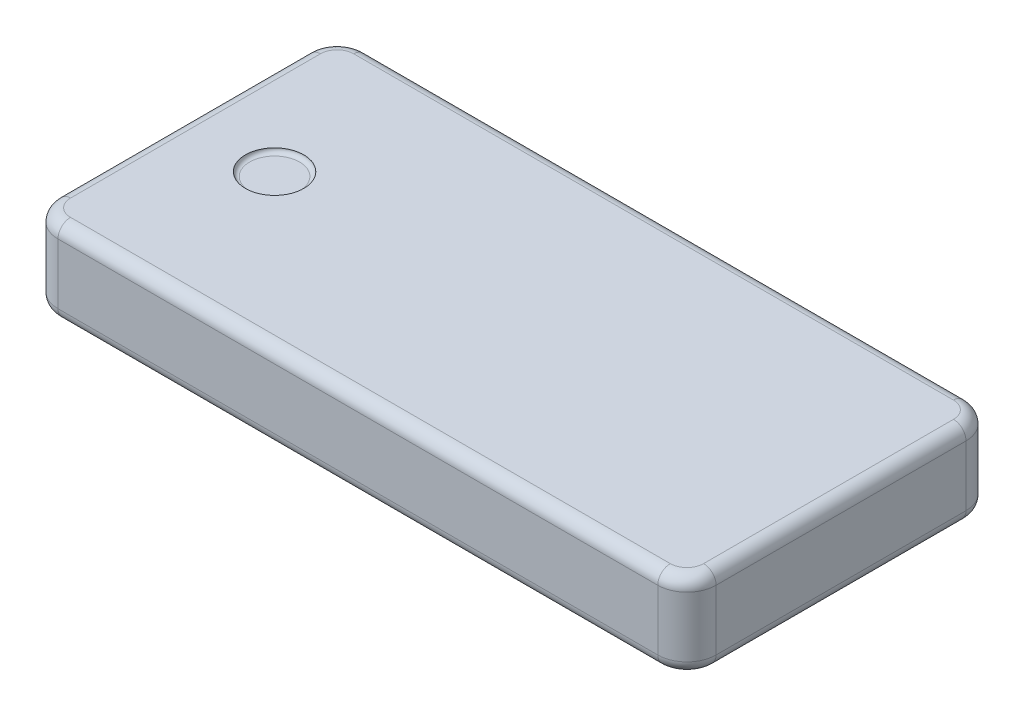
ISO-10303-21;
HEADER;
FILE_DESCRIPTION(('STEP AP214'),'2;1');
FILE_NAME('part.step','',(''),(''),'','','');
FILE_SCHEMA(('AUTOMOTIVE_DESIGN { 1 0 10303 214 1 1 1 1 }'));
ENDSEC;
DATA;
#1=APPLICATION_CONTEXT('core data for automotive mechanical design processes');
#2=APPLICATION_PROTOCOL_DEFINITION('international standard','automotive_design',2000,#1);
#3=PRODUCT_CONTEXT('',#1,'mechanical');
#4=PRODUCT('Part','Part','',(#3));
#5=PRODUCT_RELATED_PRODUCT_CATEGORY('part','',(#4));
#6=PRODUCT_DEFINITION_FORMATION('','',#4);
#7=PRODUCT_DEFINITION_CONTEXT('part definition',#1,'design');
#8=PRODUCT_DEFINITION('design','',#6,#7);
#9=PRODUCT_DEFINITION_SHAPE('','',#8);
#10=(LENGTH_UNIT() NAMED_UNIT(*) SI_UNIT(.MILLI.,.METRE.));
#11=(NAMED_UNIT(*) PLANE_ANGLE_UNIT() SI_UNIT($,.RADIAN.));
#12=(NAMED_UNIT(*) SI_UNIT($,.STERADIAN.) SOLID_ANGLE_UNIT());
#13=UNCERTAINTY_MEASURE_WITH_UNIT(LENGTH_MEASURE(1.E-05),#10,'distance_accuracy_value','');
#14=(GEOMETRIC_REPRESENTATION_CONTEXT(3) GLOBAL_UNCERTAINTY_ASSIGNED_CONTEXT((#13)) GLOBAL_UNIT_ASSIGNED_CONTEXT((#10,
#11,#12)) REPRESENTATION_CONTEXT('',''));
#15=CARTESIAN_POINT('',(0.,0.,0.));
#16=DIRECTION('',(0.,0.,1.));
#17=DIRECTION('',(1.,0.,0.));
#18=AXIS2_PLACEMENT_3D('',#15,#16,#17);
#19=CARTESIAN_POINT('',(151.,20.5,-67.));
#20=DIRECTION('',(0.,-1.,0.));
#21=DIRECTION('',(0.,0.,-1.));
#22=AXIS2_PLACEMENT_3D('',#19,#20,#21);
#23=CYLINDRICAL_SURFACE('',#22,7.00000000000001);
#24=DIRECTION('',(0.,-1.,0.));
#25=VECTOR('',#24,1.);
#26=CARTESIAN_POINT('',(158.,20.5,-67.));
#27=LINE('',#26,#25);
#28=CARTESIAN_POINT('',(158.,17.5,-67.));
#29=VERTEX_POINT('',#28);
#30=CARTESIAN_POINT('',(158.,3.,-67.));
#31=VERTEX_POINT('',#30);
#32=EDGE_CURVE('E265',#29,#31,#27,.T.);
#33=ORIENTED_EDGE('',*,*,#32,.T.);
#34=CARTESIAN_POINT('',(151.,3.,-67.));
#35=DIRECTION('',(0.,-1.,0.));
#36=DIRECTION('',(0.,0.,-1.));
#37=AXIS2_PLACEMENT_3D('',#34,#35,#36);
#38=CIRCLE('',#37,7.00000000000001);
#39=CARTESIAN_POINT('',(151.,3.,-74.));
#40=VERTEX_POINT('',#39);
#41=EDGE_CURVE('E344',#31,#40,#38,.F.);
#42=ORIENTED_EDGE('',*,*,#41,.T.);
#43=DIRECTION('',(0.,-1.,0.));
#44=VECTOR('',#43,1.);
#45=CARTESIAN_POINT('',(151.,20.5,-74.));
#46=LINE('',#45,#44);
#47=CARTESIAN_POINT('',(151.,17.5,-74.));
#48=VERTEX_POINT('',#47);
#49=EDGE_CURVE('E188',#48,#40,#46,.T.);
#50=ORIENTED_EDGE('',*,*,#49,.F.);
#51=CARTESIAN_POINT('',(151.,17.5,-67.));
#52=DIRECTION('',(0.,-1.,0.));
#53=DIRECTION('',(0.,0.,-1.));
#54=AXIS2_PLACEMENT_3D('',#51,#52,#53);
#55=CIRCLE('',#54,7.00000000000001);
#56=EDGE_CURVE('E341',#48,#29,#55,.T.);
#57=ORIENTED_EDGE('',*,*,#56,.T.);
#58=EDGE_LOOP('',(#33,#42,#50,#57));
#59=FACE_BOUND('',#58,.T.);
#60=ADVANCED_FACE('F39',(#59),#23,.T.);
#61=CARTESIAN_POINT('',(7.,20.5,-74.));
#62=DIRECTION('',(0.,0.,1.));
#63=DIRECTION('',(1.,0.,0.));
#64=AXIS2_PLACEMENT_3D('',#61,#62,#63);
#65=PLANE('',#64);
#66=ORIENTED_EDGE('',*,*,#49,.T.);
#67=DIRECTION('',(-1.,0.,0.));
#68=VECTOR('',#67,1.);
#69=CARTESIAN_POINT('',(7.,3.,-74.));
#70=LINE('',#69,#68);
#71=CARTESIAN_POINT('',(7.,3.,-74.));
#72=VERTEX_POINT('',#71);
#73=EDGE_CURVE('E338',#40,#72,#70,.T.);
#74=ORIENTED_EDGE('',*,*,#73,.T.);
#75=DIRECTION('',(0.,-1.,0.));
#76=VECTOR('',#75,1.);
#77=CARTESIAN_POINT('',(7.,20.5,-74.));
#78=LINE('',#77,#76);
#79=CARTESIAN_POINT('',(7.,17.5,-74.));
#80=VERTEX_POINT('',#79);
#81=EDGE_CURVE('E289',#80,#72,#78,.T.);
#82=ORIENTED_EDGE('',*,*,#81,.F.);
#83=DIRECTION('',(-1.,0.,0.));
#84=VECTOR('',#83,1.);
#85=CARTESIAN_POINT('',(7.,17.5,-74.));
#86=LINE('',#85,#84);
#87=EDGE_CURVE('E335',#80,#48,#86,.F.);
#88=ORIENTED_EDGE('',*,*,#87,.T.);
#89=EDGE_LOOP('',(#66,#74,#82,#88));
#90=FACE_BOUND('',#89,.T.);
#91=ADVANCED_FACE('F429',(#90),#65,.F.);
#92=CARTESIAN_POINT('',(7.,20.5,-67.));
#93=DIRECTION('',(0.,-1.,0.));
#94=DIRECTION('',(0.,0.,-1.));
#95=AXIS2_PLACEMENT_3D('',#92,#93,#94);
#96=CYLINDRICAL_SURFACE('',#95,7.);
#97=ORIENTED_EDGE('',*,*,#81,.T.);
#98=CARTESIAN_POINT('',(7.,3.,-67.));
#99=DIRECTION('',(0.,-1.,0.));
#100=DIRECTION('',(0.,0.,-1.));
#101=AXIS2_PLACEMENT_3D('',#98,#99,#100);
#102=CIRCLE('',#101,7.);
#103=CARTESIAN_POINT('',(0.,3.,-67.));
#104=VERTEX_POINT('',#103);
#105=EDGE_CURVE('E332',#72,#104,#102,.F.);
#106=ORIENTED_EDGE('',*,*,#105,.T.);
#107=DIRECTION('',(0.,-1.,0.));
#108=VECTOR('',#107,1.);
#109=CARTESIAN_POINT('',(0.,20.5,-67.));
#110=LINE('',#109,#108);
#111=CARTESIAN_POINT('',(0.,17.5,-67.));
#112=VERTEX_POINT('',#111);
#113=EDGE_CURVE('E285',#112,#104,#110,.T.);
#114=ORIENTED_EDGE('',*,*,#113,.F.);
#115=CARTESIAN_POINT('',(7.,17.5,-67.));
#116=DIRECTION('',(0.,-1.,0.));
#117=DIRECTION('',(0.,0.,-1.));
#118=AXIS2_PLACEMENT_3D('',#115,#116,#117);
#119=CIRCLE('',#118,7.);
#120=EDGE_CURVE('E329',#112,#80,#119,.T.);
#121=ORIENTED_EDGE('',*,*,#120,.T.);
#122=EDGE_LOOP('',(#97,#106,#114,#121));
#123=FACE_BOUND('',#122,.T.);
#124=ADVANCED_FACE('F405',(#123),#96,.T.);
#125=CARTESIAN_POINT('',(0.,20.5,-7.));
#126=DIRECTION('',(1.,0.,0.));
#127=DIRECTION('',(0.,0.,-1.));
#128=AXIS2_PLACEMENT_3D('',#125,#126,#127);
#129=PLANE('',#128);
#130=ORIENTED_EDGE('',*,*,#113,.T.);
#131=DIRECTION('',(0.,0.,1.));
#132=VECTOR('',#131,1.);
#133=CARTESIAN_POINT('',(0.,3.,-7.));
#134=LINE('',#133,#132);
#135=CARTESIAN_POINT('',(0.,3.,-7.));
#136=VERTEX_POINT('',#135);
#137=EDGE_CURVE('E326',#104,#136,#134,.T.);
#138=ORIENTED_EDGE('',*,*,#137,.T.);
#139=DIRECTION('',(0.,-1.,0.));
#140=VECTOR('',#139,1.);
#141=CARTESIAN_POINT('',(0.,20.5,-7.));
#142=LINE('',#141,#140);
#143=CARTESIAN_POINT('',(0.,17.5,-7.));
#144=VERTEX_POINT('',#143);
#145=EDGE_CURVE('E178',#144,#136,#142,.T.);
#146=ORIENTED_EDGE('',*,*,#145,.F.);
#147=DIRECTION('',(0.,0.,1.));
#148=VECTOR('',#147,1.);
#149=CARTESIAN_POINT('',(0.,17.5,-7.));
#150=LINE('',#149,#148);
#151=EDGE_CURVE('E323',#144,#112,#150,.F.);
#152=ORIENTED_EDGE('',*,*,#151,.T.);
#153=EDGE_LOOP('',(#130,#138,#146,#152));
#154=FACE_BOUND('',#153,.T.);
#155=ADVANCED_FACE('F402',(#154),#129,.F.);
#156=CARTESIAN_POINT('',(7.,20.5,-7.));
#157=DIRECTION('',(0.,-1.,0.));
#158=DIRECTION('',(0.,0.,-1.));
#159=AXIS2_PLACEMENT_3D('',#156,#157,#158);
#160=CYLINDRICAL_SURFACE('',#159,7.);
#161=ORIENTED_EDGE('',*,*,#145,.T.);
#162=CARTESIAN_POINT('',(7.,3.,-7.));
#163=DIRECTION('',(0.,-1.,0.));
#164=DIRECTION('',(0.,0.,-1.));
#165=AXIS2_PLACEMENT_3D('',#162,#163,#164);
#166=CIRCLE('',#165,7.);
#167=CARTESIAN_POINT('',(7.,3.,0.));
#168=VERTEX_POINT('',#167);
#169=EDGE_CURVE('E176',#136,#168,#166,.F.);
#170=ORIENTED_EDGE('',*,*,#169,.T.);
#171=DIRECTION('',(0.,-1.,0.));
#172=VECTOR('',#171,1.);
#173=CARTESIAN_POINT('',(7.,20.5,0.));
#174=LINE('',#173,#172);
#175=CARTESIAN_POINT('',(7.,17.5,0.));
#176=VERTEX_POINT('',#175);
#177=EDGE_CURVE('E157',#176,#168,#174,.T.);
#178=ORIENTED_EDGE('',*,*,#177,.F.);
#179=CARTESIAN_POINT('',(7.,17.5,-7.));
#180=DIRECTION('',(0.,-1.,0.));
#181=DIRECTION('',(0.,0.,-1.));
#182=AXIS2_PLACEMENT_3D('',#179,#180,#181);
#183=CIRCLE('',#182,7.);
#184=EDGE_CURVE('E173',#176,#144,#183,.T.);
#185=ORIENTED_EDGE('',*,*,#184,.T.);
#186=EDGE_LOOP('',(#161,#170,#178,#185));
#187=FACE_BOUND('',#186,.T.);
#188=ADVANCED_FACE('F172',(#187),#160,.T.);
#189=CARTESIAN_POINT('',(7.,20.5,0.));
#190=DIRECTION('',(0.,0.,-1.));
#191=DIRECTION('',(-1.,0.,0.));
#192=AXIS2_PLACEMENT_3D('',#189,#190,#191);
#193=PLANE('',#192);
#194=ORIENTED_EDGE('',*,*,#177,.T.);
#195=DIRECTION('',(1.,0.,0.));
#196=VECTOR('',#195,1.);
#197=CARTESIAN_POINT('',(151.,3.,0.));
#198=LINE('',#197,#196);
#199=CARTESIAN_POINT('',(151.,3.,0.));
#200=VERTEX_POINT('',#199);
#201=EDGE_CURVE('E48',#168,#200,#198,.T.);
#202=ORIENTED_EDGE('',*,*,#201,.T.);
#203=DIRECTION('',(0.,-1.,0.));
#204=VECTOR('',#203,1.);
#205=CARTESIAN_POINT('',(151.,20.5,0.));
#206=LINE('',#205,#204);
#207=CARTESIAN_POINT('',(151.,17.5,0.));
#208=VERTEX_POINT('',#207);
#209=EDGE_CURVE('E159',#208,#200,#206,.T.);
#210=ORIENTED_EDGE('',*,*,#209,.F.);
#211=DIRECTION('',(1.,0.,0.));
#212=VECTOR('',#211,1.);
#213=CARTESIAN_POINT('',(7.,17.5,0.));
#214=LINE('',#213,#212);
#215=EDGE_CURVE('E154',#208,#176,#214,.F.);
#216=ORIENTED_EDGE('',*,*,#215,.T.);
#217=EDGE_LOOP('',(#194,#202,#210,#216));
#218=FACE_BOUND('',#217,.T.);
#219=ADVANCED_FACE('F156',(#218),#193,.F.);
#220=CARTESIAN_POINT('',(151.,20.5,-7.));
#221=DIRECTION('',(0.,-1.,0.));
#222=DIRECTION('',(0.,0.,-1.));
#223=AXIS2_PLACEMENT_3D('',#220,#221,#222);
#224=CYLINDRICAL_SURFACE('',#223,7.);
#225=ORIENTED_EDGE('',*,*,#209,.T.);
#226=CARTESIAN_POINT('',(151.,3.,-7.));
#227=DIRECTION('',(0.,-1.,0.));
#228=DIRECTION('',(0.,0.,-1.));
#229=AXIS2_PLACEMENT_3D('',#226,#227,#228);
#230=CIRCLE('',#229,7.);
#231=CARTESIAN_POINT('',(158.,3.,-7.));
#232=VERTEX_POINT('',#231);
#233=EDGE_CURVE('E356',#200,#232,#230,.F.);
#234=ORIENTED_EDGE('',*,*,#233,.T.);
#235=DIRECTION('',(0.,-1.,0.));
#236=VECTOR('',#235,1.);
#237=CARTESIAN_POINT('',(158.,20.5,-7.));
#238=LINE('',#237,#236);
#239=CARTESIAN_POINT('',(158.,17.5,-7.));
#240=VERTEX_POINT('',#239);
#241=EDGE_CURVE('E272',#240,#232,#238,.T.);
#242=ORIENTED_EDGE('',*,*,#241,.F.);
#243=CARTESIAN_POINT('',(151.,17.5,-7.));
#244=DIRECTION('',(0.,-1.,0.));
#245=DIRECTION('',(0.,0.,-1.));
#246=AXIS2_PLACEMENT_3D('',#243,#244,#245);
#247=CIRCLE('',#246,7.);
#248=EDGE_CURVE('E353',#240,#208,#247,.T.);
#249=ORIENTED_EDGE('',*,*,#248,.T.);
#250=EDGE_LOOP('',(#225,#234,#242,#249));
#251=FACE_BOUND('',#250,.T.);
#252=ADVANCED_FACE('F444',(#251),#224,.T.);
#253=CARTESIAN_POINT('',(158.,20.5,-7.));
#254=DIRECTION('',(-1.,0.,0.));
#255=DIRECTION('',(0.,0.,1.));
#256=AXIS2_PLACEMENT_3D('',#253,#254,#255);
#257=PLANE('',#256);
#258=ORIENTED_EDGE('',*,*,#241,.T.);
#259=DIRECTION('',(0.,0.,-1.));
#260=VECTOR('',#259,1.);
#261=CARTESIAN_POINT('',(158.,3.,-67.));
#262=LINE('',#261,#260);
#263=EDGE_CURVE('E350',#232,#31,#262,.T.);
#264=ORIENTED_EDGE('',*,*,#263,.T.);
#265=ORIENTED_EDGE('',*,*,#32,.F.);
#266=DIRECTION('',(0.,0.,-1.));
#267=VECTOR('',#266,1.);
#268=CARTESIAN_POINT('',(158.,17.5,-7.));
#269=LINE('',#268,#267);
#270=EDGE_CURVE('E347',#29,#240,#269,.F.);
#271=ORIENTED_EDGE('',*,*,#270,.T.);
#272=EDGE_LOOP('',(#258,#264,#265,#271));
#273=FACE_BOUND('',#272,.T.);
#274=ADVANCED_FACE('F447',(#273),#257,.F.);
#275=CARTESIAN_POINT('',(151.,20.5,-67.));
#276=DIRECTION('',(0.,-1.,0.));
#277=DIRECTION('',(0.,0.,-1.));
#278=AXIS2_PLACEMENT_3D('',#275,#276,#277);
#279=PLANE('',#278);
#280=CARTESIAN_POINT('',(22.,20.5,-37.));
#281=DIRECTION('',(0.,1.,0.));
#282=DIRECTION('',(0.,0.,1.));
#283=AXIS2_PLACEMENT_3D('',#280,#281,#282);
#284=CIRCLE('',#283,7.);
#285=CARTESIAN_POINT('',(22.,20.5,-30.));
#286=VERTEX_POINT('',#285);
#287=EDGE_CURVE('E193',#286,#286,#284,.T.);
#288=ORIENTED_EDGE('',*,*,#287,.F.);
#289=EDGE_LOOP('',(#288));
#290=FACE_BOUND('',#289,.T.);
#291=DIRECTION('',(0.,0.,1.));
#292=VECTOR('',#291,1.);
#293=CARTESIAN_POINT('',(3.,20.5,-67.));
#294=LINE('',#293,#292);
#295=CARTESIAN_POINT('',(3.,20.5,-67.));
#296=VERTEX_POINT('',#295);
#297=CARTESIAN_POINT('',(3.,20.5,-7.));
#298=VERTEX_POINT('',#297);
#299=EDGE_CURVE('E55',#296,#298,#294,.T.);
#300=ORIENTED_EDGE('',*,*,#299,.T.);
#301=CARTESIAN_POINT('',(7.,20.5,-7.));
#302=DIRECTION('',(0.,-1.,0.));
#303=DIRECTION('',(0.,0.,-1.));
#304=AXIS2_PLACEMENT_3D('',#301,#302,#303);
#305=CIRCLE('',#304,4.);
#306=CARTESIAN_POINT('',(7.,20.5,-3.));
#307=VERTEX_POINT('',#306);
#308=EDGE_CURVE('E165',#298,#307,#305,.F.);
#309=ORIENTED_EDGE('',*,*,#308,.T.);
#310=DIRECTION('',(1.,0.,0.));
#311=VECTOR('',#310,1.);
#312=CARTESIAN_POINT('',(151.,20.5,-3.));
#313=LINE('',#312,#311);
#314=CARTESIAN_POINT('',(151.,20.5,-3.));
#315=VERTEX_POINT('',#314);
#316=EDGE_CURVE('E191',#307,#315,#313,.T.);
#317=ORIENTED_EDGE('',*,*,#316,.T.);
#318=CARTESIAN_POINT('',(151.,20.5,-7.));
#319=DIRECTION('',(0.,-1.,0.));
#320=DIRECTION('',(0.,0.,-1.));
#321=AXIS2_PLACEMENT_3D('',#318,#319,#320);
#322=CIRCLE('',#321,4.);
#323=CARTESIAN_POINT('',(155.,20.5,-7.));
#324=VERTEX_POINT('',#323);
#325=EDGE_CURVE('E361',#315,#324,#322,.F.);
#326=ORIENTED_EDGE('',*,*,#325,.T.);
#327=DIRECTION('',(0.,0.,-1.));
#328=VECTOR('',#327,1.);
#329=CARTESIAN_POINT('',(155.,20.5,-67.));
#330=LINE('',#329,#328);
#331=CARTESIAN_POINT('',(155.,20.5,-67.));
#332=VERTEX_POINT('',#331);
#333=EDGE_CURVE('E364',#324,#332,#330,.T.);
#334=ORIENTED_EDGE('',*,*,#333,.T.);
#335=CARTESIAN_POINT('',(151.,20.5,-67.));
#336=DIRECTION('',(0.,-1.,0.));
#337=DIRECTION('',(0.,0.,-1.));
#338=AXIS2_PLACEMENT_3D('',#335,#336,#337);
#339=CIRCLE('',#338,4.00000000000001);
#340=CARTESIAN_POINT('',(151.,20.5,-71.));
#341=VERTEX_POINT('',#340);
#342=EDGE_CURVE('E367',#332,#341,#339,.F.);
#343=ORIENTED_EDGE('',*,*,#342,.T.);
#344=DIRECTION('',(-1.,0.,0.));
#345=VECTOR('',#344,1.);
#346=CARTESIAN_POINT('',(151.,20.5,-71.));
#347=LINE('',#346,#345);
#348=CARTESIAN_POINT('',(7.,20.5,-71.));
#349=VERTEX_POINT('',#348);
#350=EDGE_CURVE('E370',#341,#349,#347,.T.);
#351=ORIENTED_EDGE('',*,*,#350,.T.);
#352=CARTESIAN_POINT('',(7.,20.5,-67.));
#353=DIRECTION('',(0.,-1.,0.));
#354=DIRECTION('',(0.,0.,-1.));
#355=AXIS2_PLACEMENT_3D('',#352,#353,#354);
#356=CIRCLE('',#355,4.);
#357=EDGE_CURVE('E60',#349,#296,#356,.F.);
#358=ORIENTED_EDGE('',*,*,#357,.T.);
#359=EDGE_LOOP('',(#300,#309,#317,#326,#334,#343,#351,#358));
#360=FACE_BOUND('',#359,.T.);
#361=ADVANCED_FACE('F378',(#290,#360),#279,.F.);
#362=CARTESIAN_POINT('',(151.,0.,-67.));
#363=DIRECTION('',(0.,-1.,0.));
#364=DIRECTION('',(0.,0.,-1.));
#365=AXIS2_PLACEMENT_3D('',#362,#363,#364);
#366=PLANE('',#365);
#367=DIRECTION('',(1.,0.,0.));
#368=VECTOR('',#367,1.);
#369=CARTESIAN_POINT('',(7.,0.,-3.));
#370=LINE('',#369,#368);
#371=CARTESIAN_POINT('',(151.,0.,-3.));
#372=VERTEX_POINT('',#371);
#373=CARTESIAN_POINT('',(7.,0.,-3.));
#374=VERTEX_POINT('',#373);
#375=EDGE_CURVE('E298',#372,#374,#370,.F.);
#376=ORIENTED_EDGE('',*,*,#375,.T.);
#377=CARTESIAN_POINT('',(7.,0.,-7.));
#378=DIRECTION('',(0.,-1.,0.));
#379=DIRECTION('',(0.,0.,-1.));
#380=AXIS2_PLACEMENT_3D('',#377,#378,#379);
#381=CIRCLE('',#380,4.);
#382=CARTESIAN_POINT('',(3.,0.,-7.));
#383=VERTEX_POINT('',#382);
#384=EDGE_CURVE('E319',#374,#383,#381,.T.);
#385=ORIENTED_EDGE('',*,*,#384,.T.);
#386=DIRECTION('',(0.,0.,1.));
#387=VECTOR('',#386,1.);
#388=CARTESIAN_POINT('',(3.,0.,-67.));
#389=LINE('',#388,#387);
#390=CARTESIAN_POINT('',(3.,0.,-67.));
#391=VERTEX_POINT('',#390);
#392=EDGE_CURVE('E316',#383,#391,#389,.F.);
#393=ORIENTED_EDGE('',*,*,#392,.T.);
#394=CARTESIAN_POINT('',(7.,0.,-67.));
#395=DIRECTION('',(0.,-1.,0.));
#396=DIRECTION('',(0.,0.,-1.));
#397=AXIS2_PLACEMENT_3D('',#394,#395,#396);
#398=CIRCLE('',#397,4.);
#399=CARTESIAN_POINT('',(7.,0.,-71.));
#400=VERTEX_POINT('',#399);
#401=EDGE_CURVE('E313',#391,#400,#398,.T.);
#402=ORIENTED_EDGE('',*,*,#401,.T.);
#403=DIRECTION('',(-1.,0.,0.));
#404=VECTOR('',#403,1.);
#405=CARTESIAN_POINT('',(151.,0.,-71.));
#406=LINE('',#405,#404);
#407=CARTESIAN_POINT('',(151.,0.,-71.));
#408=VERTEX_POINT('',#407);
#409=EDGE_CURVE('E310',#400,#408,#406,.F.);
#410=ORIENTED_EDGE('',*,*,#409,.T.);
#411=CARTESIAN_POINT('',(151.,0.,-67.));
#412=DIRECTION('',(0.,-1.,0.));
#413=DIRECTION('',(0.,0.,-1.));
#414=AXIS2_PLACEMENT_3D('',#411,#412,#413);
#415=CIRCLE('',#414,4.00000000000001);
#416=CARTESIAN_POINT('',(155.,0.,-67.));
#417=VERTEX_POINT('',#416);
#418=EDGE_CURVE('E307',#408,#417,#415,.T.);
#419=ORIENTED_EDGE('',*,*,#418,.T.);
#420=DIRECTION('',(0.,0.,-1.));
#421=VECTOR('',#420,1.);
#422=CARTESIAN_POINT('',(155.,0.,-7.));
#423=LINE('',#422,#421);
#424=CARTESIAN_POINT('',(155.,0.,-7.));
#425=VERTEX_POINT('',#424);
#426=EDGE_CURVE('E304',#417,#425,#423,.F.);
#427=ORIENTED_EDGE('',*,*,#426,.T.);
#428=CARTESIAN_POINT('',(151.,0.,-7.));
#429=DIRECTION('',(0.,-1.,0.));
#430=DIRECTION('',(0.,0.,-1.));
#431=AXIS2_PLACEMENT_3D('',#428,#429,#430);
#432=CIRCLE('',#431,4.);
#433=EDGE_CURVE('E301',#425,#372,#432,.T.);
#434=ORIENTED_EDGE('',*,*,#433,.T.);
#435=EDGE_LOOP('',(#376,#385,#393,#402,#410,#419,#427,#434));
#436=FACE_BOUND('',#435,.T.);
#437=ADVANCED_FACE('F452',(#436),#366,.T.);
#438=CARTESIAN_POINT('',(151.,3.,-67.));
#439=DIRECTION('',(0.,-1.,0.));
#440=DIRECTION('',(0.,0.,-1.));
#441=AXIS2_PLACEMENT_3D('',#438,#439,#440);
#442=TOROIDAL_SURFACE('',#441,4.00000000000001,3.);
#443=CARTESIAN_POINT('',(155.,3.,-67.));
#444=DIRECTION('',(0.,0.,1.));
#445=DIRECTION('',(1.,0.,0.));
#446=AXIS2_PLACEMENT_3D('',#443,#444,#445);
#447=CIRCLE('',#446,3.);
#448=EDGE_CURVE('E256',#417,#31,#447,.T.);
#449=ORIENTED_EDGE('',*,*,#448,.F.);
#450=ORIENTED_EDGE('',*,*,#418,.F.);
#451=CARTESIAN_POINT('',(151.,3.,-71.));
#452=DIRECTION('',(-1.,0.,0.));
#453=DIRECTION('',(0.,0.,1.));
#454=AXIS2_PLACEMENT_3D('',#451,#452,#453);
#455=CIRCLE('',#454,3.);
#456=EDGE_CURVE('E202',#40,#408,#455,.T.);
#457=ORIENTED_EDGE('',*,*,#456,.F.);
#458=ORIENTED_EDGE('',*,*,#41,.F.);
#459=EDGE_LOOP('',(#449,#450,#457,#458));
#460=FACE_BOUND('',#459,.T.);
#461=ADVANCED_FACE('F455',(#460),#442,.T.);
#462=CARTESIAN_POINT('',(7.,3.,-71.));
#463=DIRECTION('',(1.,0.,0.));
#464=DIRECTION('',(0.,0.,-1.));
#465=AXIS2_PLACEMENT_3D('',#462,#463,#464);
#466=CYLINDRICAL_SURFACE('',#465,3.);
#467=ORIENTED_EDGE('',*,*,#456,.T.);
#468=ORIENTED_EDGE('',*,*,#409,.F.);
#469=CARTESIAN_POINT('',(7.,3.,-71.));
#470=DIRECTION('',(-1.,0.,0.));
#471=DIRECTION('',(0.,0.,1.));
#472=AXIS2_PLACEMENT_3D('',#469,#470,#471);
#473=CIRCLE('',#472,3.);
#474=EDGE_CURVE('E253',#72,#400,#473,.T.);
#475=ORIENTED_EDGE('',*,*,#474,.F.);
#476=ORIENTED_EDGE('',*,*,#73,.F.);
#477=EDGE_LOOP('',(#467,#468,#475,#476));
#478=FACE_BOUND('',#477,.T.);
#479=ADVANCED_FACE('F546',(#478),#466,.T.);
#480=CARTESIAN_POINT('',(155.,3.,-7.));
#481=DIRECTION('',(0.,0.,1.));
#482=DIRECTION('',(1.,0.,0.));
#483=AXIS2_PLACEMENT_3D('',#480,#481,#482);
#484=CYLINDRICAL_SURFACE('',#483,3.);
#485=ORIENTED_EDGE('',*,*,#448,.T.);
#486=ORIENTED_EDGE('',*,*,#263,.F.);
#487=CARTESIAN_POINT('',(155.,3.,-7.));
#488=DIRECTION('',(0.,0.,1.));
#489=DIRECTION('',(1.,0.,0.));
#490=AXIS2_PLACEMENT_3D('',#487,#488,#489);
#491=CIRCLE('',#490,3.);
#492=EDGE_CURVE('E249',#425,#232,#491,.T.);
#493=ORIENTED_EDGE('',*,*,#492,.F.);
#494=ORIENTED_EDGE('',*,*,#426,.F.);
#495=EDGE_LOOP('',(#485,#486,#493,#494));
#496=FACE_BOUND('',#495,.T.);
#497=ADVANCED_FACE('F553',(#496),#484,.T.);
#498=CARTESIAN_POINT('',(7.,3.,-67.));
#499=DIRECTION('',(0.,-1.,0.));
#500=DIRECTION('',(0.,0.,-1.));
#501=AXIS2_PLACEMENT_3D('',#498,#499,#500);
#502=TOROIDAL_SURFACE('',#501,4.,3.);
#503=ORIENTED_EDGE('',*,*,#474,.T.);
#504=ORIENTED_EDGE('',*,*,#401,.F.);
#505=CARTESIAN_POINT('',(3.,3.,-67.));
#506=DIRECTION('',(0.,0.,1.));
#507=DIRECTION('',(1.,0.,0.));
#508=AXIS2_PLACEMENT_3D('',#505,#506,#507);
#509=CIRCLE('',#508,3.);
#510=EDGE_CURVE('E245',#104,#391,#509,.T.);
#511=ORIENTED_EDGE('',*,*,#510,.F.);
#512=ORIENTED_EDGE('',*,*,#105,.F.);
#513=EDGE_LOOP('',(#503,#504,#511,#512));
#514=FACE_BOUND('',#513,.T.);
#515=ADVANCED_FACE('F410',(#514),#502,.T.);
#516=CARTESIAN_POINT('',(151.,3.,-7.));
#517=DIRECTION('',(0.,-1.,0.));
#518=DIRECTION('',(0.,0.,-1.));
#519=AXIS2_PLACEMENT_3D('',#516,#517,#518);
#520=TOROIDAL_SURFACE('',#519,4.,3.);
#521=ORIENTED_EDGE('',*,*,#492,.T.);
#522=ORIENTED_EDGE('',*,*,#233,.F.);
#523=CARTESIAN_POINT('',(151.,3.,-3.));
#524=DIRECTION('',(-1.,0.,0.));
#525=DIRECTION('',(0.,0.,1.));
#526=AXIS2_PLACEMENT_3D('',#523,#524,#525);
#527=CIRCLE('',#526,3.);
#528=EDGE_CURVE('E238',#372,#200,#527,.T.);
#529=ORIENTED_EDGE('',*,*,#528,.F.);
#530=ORIENTED_EDGE('',*,*,#433,.F.);
#531=EDGE_LOOP('',(#521,#522,#529,#530));
#532=FACE_BOUND('',#531,.T.);
#533=ADVANCED_FACE('F565',(#532),#520,.T.);
#534=CARTESIAN_POINT('',(3.,3.,-7.));
#535=DIRECTION('',(0.,0.,-1.));
#536=DIRECTION('',(-1.,0.,0.));
#537=AXIS2_PLACEMENT_3D('',#534,#535,#536);
#538=CYLINDRICAL_SURFACE('',#537,3.);
#539=ORIENTED_EDGE('',*,*,#510,.T.);
#540=ORIENTED_EDGE('',*,*,#392,.F.);
#541=CARTESIAN_POINT('',(3.,3.,-7.));
#542=DIRECTION('',(0.,0.,1.));
#543=DIRECTION('',(1.,0.,0.));
#544=AXIS2_PLACEMENT_3D('',#541,#542,#543);
#545=CIRCLE('',#544,3.);
#546=EDGE_CURVE('E231',#136,#383,#545,.T.);
#547=ORIENTED_EDGE('',*,*,#546,.F.);
#548=ORIENTED_EDGE('',*,*,#137,.F.);
#549=EDGE_LOOP('',(#539,#540,#547,#548));
#550=FACE_BOUND('',#549,.T.);
#551=ADVANCED_FACE('F416',(#550),#538,.T.);
#552=CARTESIAN_POINT('',(7.,3.,-3.));
#553=DIRECTION('',(-1.,0.,0.));
#554=DIRECTION('',(0.,0.,1.));
#555=AXIS2_PLACEMENT_3D('',#552,#553,#554);
#556=CYLINDRICAL_SURFACE('',#555,3.);
#557=ORIENTED_EDGE('',*,*,#528,.T.);
#558=ORIENTED_EDGE('',*,*,#201,.F.);
#559=CARTESIAN_POINT('',(7.,3.,-3.));
#560=DIRECTION('',(-1.,0.,0.));
#561=DIRECTION('',(0.,0.,1.));
#562=AXIS2_PLACEMENT_3D('',#559,#560,#561);
#563=CIRCLE('',#562,3.);
#564=EDGE_CURVE('E225',#374,#168,#563,.T.);
#565=ORIENTED_EDGE('',*,*,#564,.F.);
#566=ORIENTED_EDGE('',*,*,#375,.F.);
#567=EDGE_LOOP('',(#557,#558,#565,#566));
#568=FACE_BOUND('',#567,.T.);
#569=ADVANCED_FACE('F419',(#568),#556,.T.);
#570=CARTESIAN_POINT('',(7.,3.,-7.));
#571=DIRECTION('',(0.,-1.,0.));
#572=DIRECTION('',(0.,0.,-1.));
#573=AXIS2_PLACEMENT_3D('',#570,#571,#572);
#574=TOROIDAL_SURFACE('',#573,4.,3.);
#575=ORIENTED_EDGE('',*,*,#546,.T.);
#576=ORIENTED_EDGE('',*,*,#384,.F.);
#577=ORIENTED_EDGE('',*,*,#564,.T.);
#578=ORIENTED_EDGE('',*,*,#169,.F.);
#579=EDGE_LOOP('',(#575,#576,#577,#578));
#580=FACE_BOUND('',#579,.T.);
#581=ADVANCED_FACE('F417',(#580),#574,.T.);
#582=CARTESIAN_POINT('',(151.,17.5,-67.));
#583=DIRECTION('',(0.,-1.,0.));
#584=DIRECTION('',(0.,0.,-1.));
#585=AXIS2_PLACEMENT_3D('',#582,#583,#584);
#586=TOROIDAL_SURFACE('',#585,4.00000000000001,3.);
#587=CARTESIAN_POINT('',(155.,17.5,-67.));
#588=DIRECTION('',(0.,0.,1.));
#589=DIRECTION('',(1.,0.,0.));
#590=AXIS2_PLACEMENT_3D('',#587,#588,#589);
#591=CIRCLE('',#590,3.);
#592=EDGE_CURVE('E219',#29,#332,#591,.T.);
#593=ORIENTED_EDGE('',*,*,#592,.F.);
#594=ORIENTED_EDGE('',*,*,#56,.F.);
#595=CARTESIAN_POINT('',(151.,17.5,-71.));
#596=DIRECTION('',(-1.,0.,0.));
#597=DIRECTION('',(0.,0.,1.));
#598=AXIS2_PLACEMENT_3D('',#595,#596,#597);
#599=CIRCLE('',#598,3.);
#600=EDGE_CURVE('E222',#341,#48,#599,.T.);
#601=ORIENTED_EDGE('',*,*,#600,.F.);
#602=ORIENTED_EDGE('',*,*,#342,.F.);
#603=EDGE_LOOP('',(#593,#594,#601,#602));
#604=FACE_BOUND('',#603,.T.);
#605=ADVANCED_FACE('F391',(#604),#586,.T.);
#606=CARTESIAN_POINT('',(151.,17.5,-71.));
#607=DIRECTION('',(-1.,0.,0.));
#608=DIRECTION('',(0.,0.,1.));
#609=AXIS2_PLACEMENT_3D('',#606,#607,#608);
#610=CYLINDRICAL_SURFACE('',#609,3.);
#611=ORIENTED_EDGE('',*,*,#600,.T.);
#612=ORIENTED_EDGE('',*,*,#87,.F.);
#613=CARTESIAN_POINT('',(7.,17.5,-71.));
#614=DIRECTION('',(-1.,0.,0.));
#615=DIRECTION('',(0.,0.,1.));
#616=AXIS2_PLACEMENT_3D('',#613,#614,#615);
#617=CIRCLE('',#616,3.);
#618=EDGE_CURVE('E215',#349,#80,#617,.T.);
#619=ORIENTED_EDGE('',*,*,#618,.F.);
#620=ORIENTED_EDGE('',*,*,#350,.F.);
#621=EDGE_LOOP('',(#611,#612,#619,#620));
#622=FACE_BOUND('',#621,.T.);
#623=ADVANCED_FACE('F394',(#622),#610,.T.);
#624=CARTESIAN_POINT('',(155.,17.5,-67.));
#625=DIRECTION('',(0.,0.,-1.));
#626=DIRECTION('',(-1.,0.,0.));
#627=AXIS2_PLACEMENT_3D('',#624,#625,#626);
#628=CYLINDRICAL_SURFACE('',#627,3.);
#629=ORIENTED_EDGE('',*,*,#592,.T.);
#630=ORIENTED_EDGE('',*,*,#333,.F.);
#631=CARTESIAN_POINT('',(155.,17.5,-7.));
#632=DIRECTION('',(0.,0.,1.));
#633=DIRECTION('',(1.,0.,0.));
#634=AXIS2_PLACEMENT_3D('',#631,#632,#633);
#635=CIRCLE('',#634,3.);
#636=EDGE_CURVE('E211',#240,#324,#635,.T.);
#637=ORIENTED_EDGE('',*,*,#636,.F.);
#638=ORIENTED_EDGE('',*,*,#270,.F.);
#639=EDGE_LOOP('',(#629,#630,#637,#638));
#640=FACE_BOUND('',#639,.T.);
#641=ADVANCED_FACE('F387',(#640),#628,.T.);
#642=CARTESIAN_POINT('',(7.,17.5,-67.));
#643=DIRECTION('',(0.,-1.,0.));
#644=DIRECTION('',(0.,0.,-1.));
#645=AXIS2_PLACEMENT_3D('',#642,#643,#644);
#646=TOROIDAL_SURFACE('',#645,4.,3.);
#647=ORIENTED_EDGE('',*,*,#618,.T.);
#648=ORIENTED_EDGE('',*,*,#120,.F.);
#649=CARTESIAN_POINT('',(3.,17.5,-67.));
#650=DIRECTION('',(0.,0.,1.));
#651=DIRECTION('',(1.,0.,0.));
#652=AXIS2_PLACEMENT_3D('',#649,#650,#651);
#653=CIRCLE('',#652,3.);
#654=EDGE_CURVE('E207',#296,#112,#653,.T.);
#655=ORIENTED_EDGE('',*,*,#654,.F.);
#656=ORIENTED_EDGE('',*,*,#357,.F.);
#657=EDGE_LOOP('',(#647,#648,#655,#656));
#658=FACE_BOUND('',#657,.T.);
#659=ADVANCED_FACE('F397',(#658),#646,.T.);
#660=CARTESIAN_POINT('',(151.,17.5,-7.));
#661=DIRECTION('',(0.,-1.,0.));
#662=DIRECTION('',(0.,0.,-1.));
#663=AXIS2_PLACEMENT_3D('',#660,#661,#662);
#664=TOROIDAL_SURFACE('',#663,4.,3.);
#665=ORIENTED_EDGE('',*,*,#636,.T.);
#666=ORIENTED_EDGE('',*,*,#325,.F.);
#667=CARTESIAN_POINT('',(151.,17.5,-3.));
#668=DIRECTION('',(-1.,0.,0.));
#669=DIRECTION('',(0.,0.,1.));
#670=AXIS2_PLACEMENT_3D('',#667,#668,#669);
#671=CIRCLE('',#670,3.);
#672=EDGE_CURVE('E197',#208,#315,#671,.T.);
#673=ORIENTED_EDGE('',*,*,#672,.F.);
#674=ORIENTED_EDGE('',*,*,#248,.F.);
#675=EDGE_LOOP('',(#665,#666,#673,#674));
#676=FACE_BOUND('',#675,.T.);
#677=ADVANCED_FACE('F382',(#676),#664,.T.);
#678=CARTESIAN_POINT('',(3.,17.5,-67.));
#679=DIRECTION('',(0.,0.,1.));
#680=DIRECTION('',(1.,0.,0.));
#681=AXIS2_PLACEMENT_3D('',#678,#679,#680);
#682=CYLINDRICAL_SURFACE('',#681,3.);
#683=ORIENTED_EDGE('',*,*,#654,.T.);
#684=ORIENTED_EDGE('',*,*,#151,.F.);
#685=CARTESIAN_POINT('',(3.,17.5,-7.));
#686=DIRECTION('',(0.,0.,1.));
#687=DIRECTION('',(1.,0.,0.));
#688=AXIS2_PLACEMENT_3D('',#685,#686,#687);
#689=CIRCLE('',#688,3.);
#690=EDGE_CURVE('E185',#298,#144,#689,.T.);
#691=ORIENTED_EDGE('',*,*,#690,.F.);
#692=ORIENTED_EDGE('',*,*,#299,.F.);
#693=EDGE_LOOP('',(#683,#684,#691,#692));
#694=FACE_BOUND('',#693,.T.);
#695=ADVANCED_FACE('F399',(#694),#682,.T.);
#696=CARTESIAN_POINT('',(151.,17.5,-3.));
#697=DIRECTION('',(1.,0.,0.));
#698=DIRECTION('',(0.,0.,-1.));
#699=AXIS2_PLACEMENT_3D('',#696,#697,#698);
#700=CYLINDRICAL_SURFACE('',#699,3.);
#701=ORIENTED_EDGE('',*,*,#672,.T.);
#702=ORIENTED_EDGE('',*,*,#316,.F.);
#703=CARTESIAN_POINT('',(7.,17.5,-3.));
#704=DIRECTION('',(-1.,0.,0.));
#705=DIRECTION('',(0.,0.,1.));
#706=AXIS2_PLACEMENT_3D('',#703,#704,#705);
#707=CIRCLE('',#706,3.);
#708=EDGE_CURVE('E183',#176,#307,#707,.T.);
#709=ORIENTED_EDGE('',*,*,#708,.F.);
#710=ORIENTED_EDGE('',*,*,#215,.F.);
#711=EDGE_LOOP('',(#701,#702,#709,#710));
#712=FACE_BOUND('',#711,.T.);
#713=ADVANCED_FACE('F190',(#712),#700,.T.);
#714=CARTESIAN_POINT('',(7.,17.5,-7.));
#715=DIRECTION('',(0.,-1.,0.));
#716=DIRECTION('',(0.,0.,-1.));
#717=AXIS2_PLACEMENT_3D('',#714,#715,#716);
#718=TOROIDAL_SURFACE('',#717,4.,3.);
#719=ORIENTED_EDGE('',*,*,#690,.T.);
#720=ORIENTED_EDGE('',*,*,#184,.F.);
#721=ORIENTED_EDGE('',*,*,#708,.T.);
#722=ORIENTED_EDGE('',*,*,#308,.F.);
#723=EDGE_LOOP('',(#719,#720,#721,#722));
#724=FACE_BOUND('',#723,.T.);
#725=ADVANCED_FACE('F181',(#724),#718,.T.);
#726=CARTESIAN_POINT('',(22.,19.5,-37.));
#727=DIRECTION('',(0.,1.,0.));
#728=DIRECTION('',(0.,0.,1.));
#729=AXIS2_PLACEMENT_3D('',#726,#727,#728);
#730=PLANE('',#729);
#731=CARTESIAN_POINT('',(22.,19.5,-37.));
#732=DIRECTION('',(0.,1.,0.));
#733=DIRECTION('',(0.,0.,1.));
#734=AXIS2_PLACEMENT_3D('',#731,#732,#733);
#735=CIRCLE('',#734,6.);
#736=CARTESIAN_POINT('',(22.,19.5,-31.));
#737=VERTEX_POINT('',#736);
#738=EDGE_CURVE('E11',#737,#737,#735,.T.);
#739=ORIENTED_EDGE('',*,*,#738,.T.);
#740=EDGE_LOOP('',(#739));
#741=FACE_BOUND('',#740,.T.);
#742=ADVANCED_FACE('F460',(#741),#730,.T.);
#743=CARTESIAN_POINT('',(22.,20.5,-37.));
#744=DIRECTION('',(0.,1.,0.));
#745=DIRECTION('',(0.,0.,1.));
#746=AXIS2_PLACEMENT_3D('',#743,#744,#745);
#747=TOROIDAL_SURFACE('',#746,6.,1.);
#748=ORIENTED_EDGE('',*,*,#287,.T.);
#749=EDGE_LOOP('',(#748));
#750=FACE_BOUND('',#749,.T.);
#751=ORIENTED_EDGE('',*,*,#738,.F.);
#752=EDGE_LOOP('',(#751));
#753=FACE_BOUND('',#752,.T.);
#754=ADVANCED_FACE('F41',(#750,#753),#747,.F.);
#755=CLOSED_SHELL('',(#60,#91,#124,#155,#188,#219,#252,#274,#361,#437,#461,#479,#497,#515,#533,
#551,#569,#581,#605,#623,#641,#659,#677,#695,#713,#725,#742,#754));
#756=MANIFOLD_SOLID_BREP('B2',#755);
#757=ADVANCED_BREP_SHAPE_REPRESENTATION('',(#18,#756),#14);
#758=SHAPE_DEFINITION_REPRESENTATION(#9,#757);
ENDSEC;
END-ISO-10303-21;
